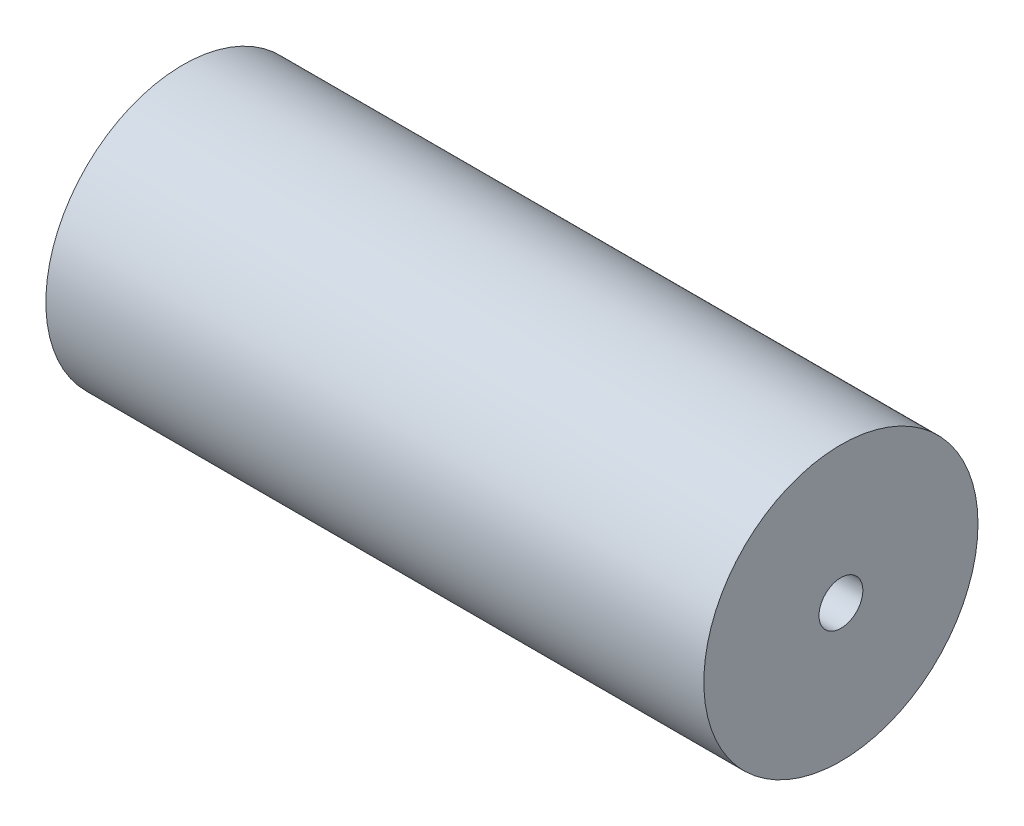
ISO-10303-21;
HEADER;
FILE_DESCRIPTION(('STEP AP214'),'2;1');
FILE_NAME('part.step','',(''),(''),'','','');
FILE_SCHEMA(('AUTOMOTIVE_DESIGN { 1 0 10303 214 1 1 1 1 }'));
ENDSEC;
DATA;
#1=APPLICATION_CONTEXT('core data for automotive mechanical design processes');
#2=APPLICATION_PROTOCOL_DEFINITION('international standard','automotive_design',2000,#1);
#3=PRODUCT_CONTEXT('',#1,'mechanical');
#4=PRODUCT('Part','Part','',(#3));
#5=PRODUCT_RELATED_PRODUCT_CATEGORY('part','',(#4));
#6=PRODUCT_DEFINITION_FORMATION('','',#4);
#7=PRODUCT_DEFINITION_CONTEXT('part definition',#1,'design');
#8=PRODUCT_DEFINITION('design','',#6,#7);
#9=PRODUCT_DEFINITION_SHAPE('','',#8);
#10=(LENGTH_UNIT() NAMED_UNIT(*) SI_UNIT(.MILLI.,.METRE.));
#11=(NAMED_UNIT(*) PLANE_ANGLE_UNIT() SI_UNIT($,.RADIAN.));
#12=(NAMED_UNIT(*) SI_UNIT($,.STERADIAN.) SOLID_ANGLE_UNIT());
#13=UNCERTAINTY_MEASURE_WITH_UNIT(LENGTH_MEASURE(1.E-05),#10,'distance_accuracy_value','');
#14=(GEOMETRIC_REPRESENTATION_CONTEXT(3) GLOBAL_UNCERTAINTY_ASSIGNED_CONTEXT((#13)) GLOBAL_UNIT_ASSIGNED_CONTEXT((#10,
#11,#12)) REPRESENTATION_CONTEXT('',''));
#15=CARTESIAN_POINT('',(0.,0.,0.));
#16=DIRECTION('',(0.,0.,1.));
#17=DIRECTION('',(1.,0.,0.));
#18=AXIS2_PLACEMENT_3D('',#15,#16,#17);
#19=CARTESIAN_POINT('',(60.,0.,0.));
#20=DIRECTION('',(-1.,0.,0.));
#21=DIRECTION('',(0.,0.,1.));
#22=AXIS2_PLACEMENT_3D('',#19,#20,#21);
#23=CYLINDRICAL_SURFACE('',#22,25.);
#24=CARTESIAN_POINT('',(60.,0.,0.));
#25=DIRECTION('',(1.,0.,0.));
#26=DIRECTION('',(0.,0.,-1.));
#27=AXIS2_PLACEMENT_3D('',#24,#25,#26);
#28=CIRCLE('',#27,25.);
#29=CARTESIAN_POINT('',(60.,0.,-25.));
#30=VERTEX_POINT('',#29);
#31=EDGE_CURVE('E10',#30,#30,#28,.T.);
#32=ORIENTED_EDGE('',*,*,#31,.F.);
#33=EDGE_LOOP('',(#32));
#34=FACE_BOUND('',#33,.T.);
#35=CARTESIAN_POINT('',(-60.,0.,0.));
#36=DIRECTION('',(1.,0.,0.));
#37=DIRECTION('',(0.,0.,-1.));
#38=AXIS2_PLACEMENT_3D('',#35,#36,#37);
#39=CIRCLE('',#38,25.);
#40=CARTESIAN_POINT('',(-60.,0.,-25.));
#41=VERTEX_POINT('',#40);
#42=EDGE_CURVE('E37',#41,#41,#39,.T.);
#43=ORIENTED_EDGE('',*,*,#42,.T.);
#44=EDGE_LOOP('',(#43));
#45=FACE_BOUND('',#44,.T.);
#46=ADVANCED_FACE('F34',(#34,#45),#23,.T.);
#47=CARTESIAN_POINT('',(60.,0.,0.));
#48=DIRECTION('',(1.,0.,0.));
#49=DIRECTION('',(0.,0.,-1.));
#50=AXIS2_PLACEMENT_3D('',#47,#48,#49);
#51=PLANE('',#50);
#52=CARTESIAN_POINT('',(60.,0.,0.));
#53=DIRECTION('',(1.,0.,0.));
#54=DIRECTION('',(0.,0.,-1.));
#55=AXIS2_PLACEMENT_3D('',#52,#53,#54);
#56=CIRCLE('',#55,4.);
#57=CARTESIAN_POINT('',(60.,0.,-4.));
#58=VERTEX_POINT('',#57);
#59=EDGE_CURVE('E46',#58,#58,#56,.T.);
#60=ORIENTED_EDGE('',*,*,#59,.F.);
#61=EDGE_LOOP('',(#60));
#62=FACE_BOUND('',#61,.T.);
#63=ORIENTED_EDGE('',*,*,#31,.T.);
#64=EDGE_LOOP('',(#63));
#65=FACE_BOUND('',#64,.T.);
#66=ADVANCED_FACE('F61',(#62,#65),#51,.T.);
#67=CARTESIAN_POINT('',(-60.,0.,0.));
#68=DIRECTION('',(1.,0.,0.));
#69=DIRECTION('',(0.,0.,-1.));
#70=AXIS2_PLACEMENT_3D('',#67,#68,#69);
#71=PLANE('',#70);
#72=CARTESIAN_POINT('',(-60.,0.,0.));
#73=DIRECTION('',(1.,0.,0.));
#74=DIRECTION('',(0.,0.,-1.));
#75=AXIS2_PLACEMENT_3D('',#72,#73,#74);
#76=CIRCLE('',#75,4.);
#77=CARTESIAN_POINT('',(-60.,0.,-4.));
#78=VERTEX_POINT('',#77);
#79=EDGE_CURVE('E44',#78,#78,#76,.T.);
#80=ORIENTED_EDGE('',*,*,#79,.T.);
#81=EDGE_LOOP('',(#80));
#82=FACE_BOUND('',#81,.T.);
#83=ORIENTED_EDGE('',*,*,#42,.F.);
#84=EDGE_LOOP('',(#83));
#85=FACE_BOUND('',#84,.T.);
#86=ADVANCED_FACE('F52',(#82,#85),#71,.F.);
#87=CARTESIAN_POINT('',(-60.,0.,0.));
#88=DIRECTION('',(1.,0.,0.));
#89=DIRECTION('',(0.,0.,-1.));
#90=AXIS2_PLACEMENT_3D('',#87,#88,#89);
#91=CYLINDRICAL_SURFACE('',#90,4.);
#92=ORIENTED_EDGE('',*,*,#79,.F.);
#93=EDGE_LOOP('',(#92));
#94=FACE_BOUND('',#93,.T.);
#95=ORIENTED_EDGE('',*,*,#59,.T.);
#96=EDGE_LOOP('',(#95));
#97=FACE_BOUND('',#96,.T.);
#98=ADVANCED_FACE('F55',(#94,#97),#91,.F.);
#99=CLOSED_SHELL('',(#46,#66,#86,#98));
#100=MANIFOLD_SOLID_BREP('B2',#99);
#101=ADVANCED_BREP_SHAPE_REPRESENTATION('',(#18,#100),#14);
#102=SHAPE_DEFINITION_REPRESENTATION(#9,#101);
ENDSEC;
END-ISO-10303-21;
